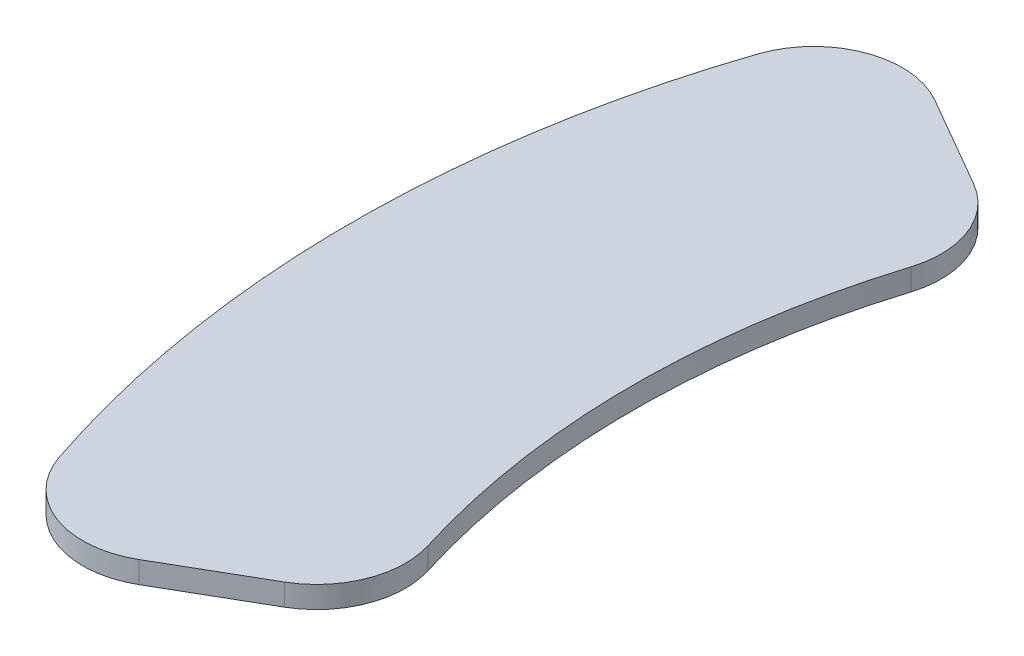
ISO-10303-21;
HEADER;
FILE_DESCRIPTION(('STEP AP214'),'2;1');
FILE_NAME('part.step','',(''),(''),'','','');
FILE_SCHEMA(('AUTOMOTIVE_DESIGN { 1 0 10303 214 1 1 1 1 }'));
ENDSEC;
DATA;
#1=APPLICATION_CONTEXT('core data for automotive mechanical design processes');
#2=APPLICATION_PROTOCOL_DEFINITION('international standard','automotive_design',2000,#1);
#3=PRODUCT_CONTEXT('',#1,'mechanical');
#4=PRODUCT('Part','Part','',(#3));
#5=PRODUCT_RELATED_PRODUCT_CATEGORY('part','',(#4));
#6=PRODUCT_DEFINITION_FORMATION('','',#4);
#7=PRODUCT_DEFINITION_CONTEXT('part definition',#1,'design');
#8=PRODUCT_DEFINITION('design','',#6,#7);
#9=PRODUCT_DEFINITION_SHAPE('','',#8);
#10=(LENGTH_UNIT() NAMED_UNIT(*) SI_UNIT(.MILLI.,.METRE.));
#11=(NAMED_UNIT(*) PLANE_ANGLE_UNIT() SI_UNIT($,.RADIAN.));
#12=(NAMED_UNIT(*) SI_UNIT($,.STERADIAN.) SOLID_ANGLE_UNIT());
#13=UNCERTAINTY_MEASURE_WITH_UNIT(LENGTH_MEASURE(1.E-05),#10,'distance_accuracy_value','');
#14=(GEOMETRIC_REPRESENTATION_CONTEXT(3) GLOBAL_UNCERTAINTY_ASSIGNED_CONTEXT((#13)) GLOBAL_UNIT_ASSIGNED_CONTEXT((#10,
#11,#12)) REPRESENTATION_CONTEXT('',''));
#15=CARTESIAN_POINT('',(0.,0.,0.));
#16=DIRECTION('',(0.,0.,1.));
#17=DIRECTION('',(1.,0.,0.));
#18=AXIS2_PLACEMENT_3D('',#15,#16,#17);
#19=CARTESIAN_POINT('',(15.2751227210385,124.639714135106,54.9515827554157));
#20=DIRECTION('',(0.,1.,0.));
#21=DIRECTION('',(0.,0.,1.));
#22=AXIS2_PLACEMENT_3D('',#19,#20,#21);
#23=CYLINDRICAL_SURFACE('',#22,5.53590230926357);
#24=CARTESIAN_POINT('',(15.2751227210385,125.999,54.9515827554157));
#25=DIRECTION('',(0.,1.,0.));
#26=DIRECTION('',(0.499999999999999,0.,-0.866025403784439));
#27=AXIS2_PLACEMENT_3D('',#24,#25,#26);
#28=CIRCLE('',#27,5.53590230926357);
#29=CARTESIAN_POINT('',(18.0430738756702,125.999,50.1573507227245));
#30=VERTEX_POINT('',#29);
#31=CARTESIAN_POINT('',(10.0270102440688,125.999,53.1898989566636));
#32=VERTEX_POINT('',#31);
#33=EDGE_CURVE('E112',#30,#32,#28,.T.);
#34=ORIENTED_EDGE('',*,*,#33,.F.);
#35=DIRECTION('',(0.,1.,0.));
#36=VECTOR('',#35,1.);
#37=CARTESIAN_POINT('',(18.0430738756702,124.639714135106,50.1573507227245));
#38=LINE('',#37,#36);
#39=CARTESIAN_POINT('',(18.0430738756702,124.639714135106,50.1573507227245));
#40=VERTEX_POINT('',#39);
#41=EDGE_CURVE('E32',#40,#30,#38,.T.);
#42=ORIENTED_EDGE('',*,*,#41,.F.);
#43=CARTESIAN_POINT('',(15.2751227210385,124.639714135106,54.9515827554157));
#44=DIRECTION('',(0.,1.,0.));
#45=DIRECTION('',(0.499999999999999,0.,-0.866025403784439));
#46=AXIS2_PLACEMENT_3D('',#43,#44,#45);
#47=CIRCLE('',#46,5.53590230926357);
#48=CARTESIAN_POINT('',(10.0270102440688,124.639714135106,53.1898989566636));
#49=VERTEX_POINT('',#48);
#50=EDGE_CURVE('E132',#40,#49,#47,.T.);
#51=ORIENTED_EDGE('',*,*,#50,.T.);
#52=DIRECTION('',(0.,1.,0.));
#53=VECTOR('',#52,1.);
#54=CARTESIAN_POINT('',(10.0270102440688,124.639714135106,53.1898989566636));
#55=LINE('',#54,#53);
#56=EDGE_CURVE('E10',#49,#32,#55,.T.);
#57=ORIENTED_EDGE('',*,*,#56,.T.);
#58=EDGE_LOOP('',(#34,#42,#51,#57));
#59=FACE_BOUND('',#58,.T.);
#60=ADVANCED_FACE('F16',(#59),#23,.T.);
#61=CARTESIAN_POINT('',(75.,124.639714135106,75.0000000000009));
#62=DIRECTION('',(0.,1.,0.));
#63=DIRECTION('',(0.,0.,1.));
#64=AXIS2_PLACEMENT_3D('',#61,#62,#63);
#65=CYLINDRICAL_SURFACE('',#64,68.5359023092635);
#66=CARTESIAN_POINT('',(75.,125.998999999999,75.0000000000009));
#67=DIRECTION('',(0.,1.,0.));
#68=DIRECTION('',(-0.948013925062882,0.,-0.318228845152146));
#69=AXIS2_PLACEMENT_3D('',#66,#67,#68);
#70=CIRCLE('',#69,68.5359023092635);
#71=CARTESIAN_POINT('',(10.0270102440688,125.998999999999,96.810101043338));
#72=VERTEX_POINT('',#71);
#73=EDGE_CURVE('E115',#32,#72,#70,.T.);
#74=ORIENTED_EDGE('',*,*,#73,.F.);
#75=ORIENTED_EDGE('',*,*,#56,.F.);
#76=CARTESIAN_POINT('',(75.,124.639714135106,75.0000000000009));
#77=DIRECTION('',(0.,1.,0.));
#78=DIRECTION('',(-0.948013925062882,0.,-0.318228845152146));
#79=AXIS2_PLACEMENT_3D('',#76,#77,#78);
#80=CIRCLE('',#79,68.5359023092635);
#81=CARTESIAN_POINT('',(10.0270102440688,124.639714135106,96.810101043338));
#82=VERTEX_POINT('',#81);
#83=EDGE_CURVE('E141',#49,#82,#80,.T.);
#84=ORIENTED_EDGE('',*,*,#83,.T.);
#85=DIRECTION('',(0.,1.,0.));
#86=VECTOR('',#85,1.);
#87=CARTESIAN_POINT('',(10.0270102440688,124.639714135106,96.810101043338));
#88=LINE('',#87,#86);
#89=EDGE_CURVE('E24',#82,#72,#88,.T.);
#90=ORIENTED_EDGE('',*,*,#89,.T.);
#91=EDGE_LOOP('',(#74,#75,#84,#90));
#92=FACE_BOUND('',#91,.T.);
#93=ADVANCED_FACE('F140',(#92),#65,.T.);
#94=CARTESIAN_POINT('',(15.2751227210384,124.639714135106,95.048417244586));
#95=DIRECTION('',(0.,1.,0.));
#96=DIRECTION('',(0.,0.,1.));
#97=AXIS2_PLACEMENT_3D('',#94,#95,#96);
#98=CYLINDRICAL_SURFACE('',#97,5.53590230926357);
#99=CARTESIAN_POINT('',(15.2751227210384,125.998999999999,95.048417244586));
#100=DIRECTION('',(0.,1.,0.));
#101=DIRECTION('',(-0.948013925062885,0.,0.318228845152137));
#102=AXIS2_PLACEMENT_3D('',#99,#100,#101);
#103=CIRCLE('',#102,5.53590230926357);
#104=CARTESIAN_POINT('',(18.0430738756702,125.998999999999,99.8426492772772));
#105=VERTEX_POINT('',#104);
#106=EDGE_CURVE('E118',#72,#105,#103,.T.);
#107=ORIENTED_EDGE('',*,*,#106,.F.);
#108=ORIENTED_EDGE('',*,*,#89,.F.);
#109=CARTESIAN_POINT('',(15.2751227210384,124.639714135106,95.048417244586));
#110=DIRECTION('',(0.,1.,0.));
#111=DIRECTION('',(-0.948013925062885,0.,0.318228845152137));
#112=AXIS2_PLACEMENT_3D('',#109,#110,#111);
#113=CIRCLE('',#112,5.53590230926357);
#114=CARTESIAN_POINT('',(18.0430738756702,124.639714135106,99.8426492772772));
#115=VERTEX_POINT('',#114);
#116=EDGE_CURVE('E150',#82,#115,#113,.T.);
#117=ORIENTED_EDGE('',*,*,#116,.T.);
#118=DIRECTION('',(0.,1.,0.));
#119=VECTOR('',#118,1.);
#120=CARTESIAN_POINT('',(18.0430738756702,124.639714135106,99.8426492772772));
#121=LINE('',#120,#119);
#122=EDGE_CURVE('E138',#115,#105,#121,.T.);
#123=ORIENTED_EDGE('',*,*,#122,.T.);
#124=EDGE_LOOP('',(#107,#108,#117,#123));
#125=FACE_BOUND('',#124,.T.);
#126=ADVANCED_FACE('F145',(#125),#98,.T.);
#127=CARTESIAN_POINT('',(18.0430738756702,124.639714135106,99.8426492772772));
#128=DIRECTION('',(0.5,0.,0.866025403784439));
#129=DIRECTION('',(0.866025403784439,0.,-0.5));
#130=AXIS2_PLACEMENT_3D('',#127,#128,#129);
#131=PLANE('',#130);
#132=DIRECTION('',(0.866025403784439,0.,-0.5));
#133=VECTOR('',#132,1.);
#134=CARTESIAN_POINT('',(18.0430738756702,125.998999999999,99.8426492772772));
#135=LINE('',#134,#133);
#136=CARTESIAN_POINT('',(23.8000299928712,125.998999999999,96.5188691132984));
#137=VERTEX_POINT('',#136);
#138=EDGE_CURVE('E121',#105,#137,#135,.T.);
#139=ORIENTED_EDGE('',*,*,#138,.F.);
#140=ORIENTED_EDGE('',*,*,#122,.F.);
#141=DIRECTION('',(0.866025403784439,0.,-0.5));
#142=VECTOR('',#141,1.);
#143=CARTESIAN_POINT('',(18.0430738756702,124.639714135106,99.8426492772772));
#144=LINE('',#143,#142);
#145=CARTESIAN_POINT('',(23.8000299928712,124.639714135106,96.5188691132984));
#146=VERTEX_POINT('',#145);
#147=EDGE_CURVE('E154',#115,#146,#144,.T.);
#148=ORIENTED_EDGE('',*,*,#147,.T.);
#149=DIRECTION('',(0.,1.,0.));
#150=VECTOR('',#149,1.);
#151=CARTESIAN_POINT('',(23.8000299928712,124.639714135106,96.5188691132984));
#152=LINE('',#151,#150);
#153=EDGE_CURVE('E136',#146,#137,#152,.T.);
#154=ORIENTED_EDGE('',*,*,#153,.T.);
#155=EDGE_LOOP('',(#139,#140,#148,#154));
#156=FACE_BOUND('',#155,.T.);
#157=ADVANCED_FACE('F161',(#156),#131,.T.);
#158=CARTESIAN_POINT('',(21.0320788382394,124.639714135106,91.7246370806072));
#159=DIRECTION('',(0.,1.,0.));
#160=DIRECTION('',(0.,0.,1.));
#161=AXIS2_PLACEMENT_3D('',#158,#159,#160);
#162=CYLINDRICAL_SURFACE('',#161,5.53590230926357);
#163=CARTESIAN_POINT('',(21.0320788382394,125.998999999999,91.7246370806072));
#164=DIRECTION('',(0.,1.,0.));
#165=DIRECTION('',(0.500000000000003,0.,0.866025403784437));
#166=AXIS2_PLACEMENT_3D('',#163,#164,#165);
#167=CIRCLE('',#166,5.53590230926357);
#168=CARTESIAN_POINT('',(26.3198866149747,125.998999999999,90.085947575543));
#169=VERTEX_POINT('',#168);
#170=EDGE_CURVE('E124',#137,#169,#167,.T.);
#171=ORIENTED_EDGE('',*,*,#170,.F.);
#172=ORIENTED_EDGE('',*,*,#153,.F.);
#173=CARTESIAN_POINT('',(21.0320788382394,124.639714135106,91.7246370806072));
#174=DIRECTION('',(0.,1.,0.));
#175=DIRECTION('',(0.500000000000003,0.,0.866025403784437));
#176=AXIS2_PLACEMENT_3D('',#173,#174,#175);
#177=CIRCLE('',#176,5.53590230926357);
#178=CARTESIAN_POINT('',(26.3198866149747,124.639714135106,90.085947575543));
#179=VERTEX_POINT('',#178);
#180=EDGE_CURVE('E103',#146,#179,#177,.T.);
#181=ORIENTED_EDGE('',*,*,#180,.T.);
#182=DIRECTION('',(0.,1.,0.));
#183=VECTOR('',#182,1.);
#184=CARTESIAN_POINT('',(26.3198866149747,124.639714135106,90.085947575543));
#185=LINE('',#184,#183);
#186=EDGE_CURVE('E95',#179,#169,#185,.T.);
#187=ORIENTED_EDGE('',*,*,#186,.T.);
#188=EDGE_LOOP('',(#171,#172,#181,#187));
#189=FACE_BOUND('',#188,.T.);
#190=ADVANCED_FACE('F158',(#189),#162,.T.);
#191=CARTESIAN_POINT('',(75.,124.639714135106,75.0000000000009));
#192=DIRECTION('',(0.,1.,0.));
#193=DIRECTION('',(0.,0.,1.));
#194=AXIS2_PLACEMENT_3D('',#191,#192,#193);
#195=CYLINDRICAL_SURFACE('',#194,50.9640976907364);
#196=CARTESIAN_POINT('',(75.,125.998999999999,75.0000000000009));
#197=DIRECTION('',(0.,-1.,0.));
#198=DIRECTION('',(-0.955184445340896,0.,0.296011275762943));
#199=AXIS2_PLACEMENT_3D('',#196,#197,#198);
#200=CIRCLE('',#199,50.9640976907364);
#201=CARTESIAN_POINT('',(26.3198866149747,125.999,59.9140524244586));
#202=VERTEX_POINT('',#201);
#203=EDGE_CURVE('E127',#169,#202,#200,.T.);
#204=ORIENTED_EDGE('',*,*,#203,.F.);
#205=ORIENTED_EDGE('',*,*,#186,.F.);
#206=CARTESIAN_POINT('',(75.,124.639714135106,75.0000000000009));
#207=DIRECTION('',(0.,-1.,0.));
#208=DIRECTION('',(-0.955184445340896,0.,0.296011275762943));
#209=AXIS2_PLACEMENT_3D('',#206,#207,#208);
#210=CIRCLE('',#209,50.9640976907364);
#211=CARTESIAN_POINT('',(26.3198866149747,124.639714135106,59.9140524244586));
#212=VERTEX_POINT('',#211);
#213=EDGE_CURVE('E98',#179,#212,#210,.T.);
#214=ORIENTED_EDGE('',*,*,#213,.T.);
#215=DIRECTION('',(0.,1.,0.));
#216=VECTOR('',#215,1.);
#217=CARTESIAN_POINT('',(26.3198866149747,124.639714135106,59.9140524244586));
#218=LINE('',#217,#216);
#219=EDGE_CURVE('E84',#212,#202,#218,.T.);
#220=ORIENTED_EDGE('',*,*,#219,.T.);
#221=EDGE_LOOP('',(#204,#205,#214,#220));
#222=FACE_BOUND('',#221,.T.);
#223=ADVANCED_FACE('F99',(#222),#195,.F.);
#224=CARTESIAN_POINT('',(21.0320788382394,124.639714135106,58.2753629193945));
#225=DIRECTION('',(0.,1.,0.));
#226=DIRECTION('',(0.,0.,1.));
#227=AXIS2_PLACEMENT_3D('',#224,#225,#226);
#228=CYLINDRICAL_SURFACE('',#227,5.53590230926358);
#229=CARTESIAN_POINT('',(21.0320788382394,125.999,58.2753629193945));
#230=DIRECTION('',(0.,1.,0.));
#231=DIRECTION('',(0.955184445340896,0.,0.296011275762942));
#232=AXIS2_PLACEMENT_3D('',#229,#230,#231);
#233=CIRCLE('',#232,5.53590230926358);
#234=CARTESIAN_POINT('',(23.8000299928712,125.999,53.4811308867033));
#235=VERTEX_POINT('',#234);
#236=EDGE_CURVE('E91',#202,#235,#233,.T.);
#237=ORIENTED_EDGE('',*,*,#236,.F.);
#238=ORIENTED_EDGE('',*,*,#219,.F.);
#239=CARTESIAN_POINT('',(21.0320788382394,124.639714135106,58.2753629193945));
#240=DIRECTION('',(0.,1.,0.));
#241=DIRECTION('',(0.955184445340896,0.,0.296011275762942));
#242=AXIS2_PLACEMENT_3D('',#239,#240,#241);
#243=CIRCLE('',#242,5.53590230926358);
#244=CARTESIAN_POINT('',(23.8000299928712,124.639714135106,53.4811308867033));
#245=VERTEX_POINT('',#244);
#246=EDGE_CURVE('E88',#212,#245,#243,.T.);
#247=ORIENTED_EDGE('',*,*,#246,.T.);
#248=DIRECTION('',(0.,1.,0.));
#249=VECTOR('',#248,1.);
#250=CARTESIAN_POINT('',(23.8000299928712,124.639714135106,53.4811308867033));
#251=LINE('',#250,#249);
#252=EDGE_CURVE('E60',#245,#235,#251,.T.);
#253=ORIENTED_EDGE('',*,*,#252,.T.);
#254=EDGE_LOOP('',(#237,#238,#247,#253));
#255=FACE_BOUND('',#254,.T.);
#256=ADVANCED_FACE('F86',(#255),#228,.T.);
#257=CARTESIAN_POINT('',(23.8000299928712,124.639714135106,53.4811308867033));
#258=DIRECTION('',(0.500000000000001,0.,-0.866025403784438));
#259=DIRECTION('',(-0.866025403784438,0.,-0.500000000000001));
#260=AXIS2_PLACEMENT_3D('',#257,#258,#259);
#261=PLANE('',#260);
#262=DIRECTION('',(-0.866025403784438,0.,-0.5));
#263=VECTOR('',#262,1.);
#264=CARTESIAN_POINT('',(23.8000299928712,125.999,53.4811308867033));
#265=LINE('',#264,#263);
#266=EDGE_CURVE('E130',#235,#30,#265,.T.);
#267=ORIENTED_EDGE('',*,*,#266,.F.);
#268=ORIENTED_EDGE('',*,*,#252,.F.);
#269=DIRECTION('',(-0.866025403784438,0.,-0.5));
#270=VECTOR('',#269,1.);
#271=CARTESIAN_POINT('',(23.8000299928712,124.639714135106,53.4811308867033));
#272=LINE('',#271,#270);
#273=EDGE_CURVE('E107',#245,#40,#272,.T.);
#274=ORIENTED_EDGE('',*,*,#273,.T.);
#275=ORIENTED_EDGE('',*,*,#41,.T.);
#276=EDGE_LOOP('',(#267,#268,#274,#275));
#277=FACE_BOUND('',#276,.T.);
#278=ADVANCED_FACE('F217',(#277),#261,.T.);
#279=CARTESIAN_POINT('',(110.457721302983,124.639714135106,90.0000000000008));
#280=DIRECTION('',(0.,1.,0.));
#281=DIRECTION('',(-1.,0.,0.));
#282=AXIS2_PLACEMENT_3D('',#279,#280,#281);
#283=PLANE('',#282);
#284=ORIENTED_EDGE('',*,*,#50,.F.);
#285=ORIENTED_EDGE('',*,*,#273,.F.);
#286=ORIENTED_EDGE('',*,*,#246,.F.);
#287=ORIENTED_EDGE('',*,*,#213,.F.);
#288=ORIENTED_EDGE('',*,*,#180,.F.);
#289=ORIENTED_EDGE('',*,*,#147,.F.);
#290=ORIENTED_EDGE('',*,*,#116,.F.);
#291=ORIENTED_EDGE('',*,*,#83,.F.);
#292=EDGE_LOOP('',(#284,#285,#286,#287,#288,#289,#290,#291));
#293=FACE_BOUND('',#292,.T.);
#294=ADVANCED_FACE('F106',(#293),#283,.F.);
#295=CARTESIAN_POINT('',(110.457721302983,125.998999999999,90.0000000000009));
#296=DIRECTION('',(0.,1.,0.));
#297=DIRECTION('',(-1.,0.,0.));
#298=AXIS2_PLACEMENT_3D('',#295,#296,#297);
#299=PLANE('',#298);
#300=ORIENTED_EDGE('',*,*,#33,.T.);
#301=ORIENTED_EDGE('',*,*,#73,.T.);
#302=ORIENTED_EDGE('',*,*,#106,.T.);
#303=ORIENTED_EDGE('',*,*,#138,.T.);
#304=ORIENTED_EDGE('',*,*,#170,.T.);
#305=ORIENTED_EDGE('',*,*,#203,.T.);
#306=ORIENTED_EDGE('',*,*,#236,.T.);
#307=ORIENTED_EDGE('',*,*,#266,.T.);
#308=EDGE_LOOP('',(#300,#301,#302,#303,#304,#305,#306,#307));
#309=FACE_BOUND('',#308,.T.);
#310=ADVANCED_FACE('F148',(#309),#299,.T.);
#311=CLOSED_SHELL('',(#60,#93,#126,#157,#190,#223,#256,#278,#294,#310));
#312=MANIFOLD_SOLID_BREP('B1',#311);
#313=ADVANCED_BREP_SHAPE_REPRESENTATION('',(#18,#312),#14);
#314=SHAPE_DEFINITION_REPRESENTATION(#9,#313);
ENDSEC;
END-ISO-10303-21;
